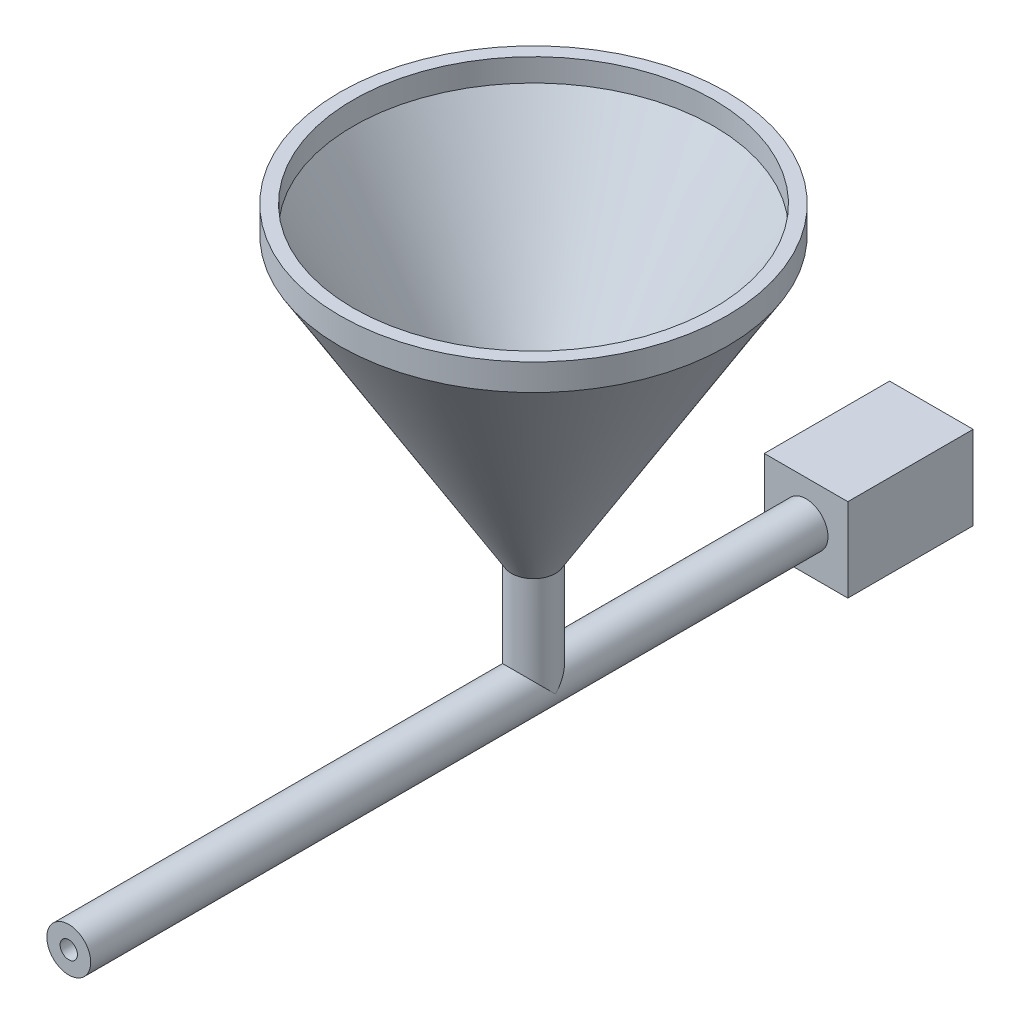
ISO-10303-21;
HEADER;
FILE_DESCRIPTION(('STEP AP214'),'2;1');
FILE_NAME('part.step','',(''),(''),'','','');
FILE_SCHEMA(('AUTOMOTIVE_DESIGN { 1 0 10303 214 1 1 1 1 }'));
ENDSEC;
DATA;
#1=APPLICATION_CONTEXT('core data for automotive mechanical design processes');
#2=APPLICATION_PROTOCOL_DEFINITION('international standard','automotive_design',2000,#1);
#3=PRODUCT_CONTEXT('',#1,'mechanical');
#4=PRODUCT('Part','Part','',(#3));
#5=PRODUCT_RELATED_PRODUCT_CATEGORY('part','',(#4));
#6=PRODUCT_DEFINITION_FORMATION('','',#4);
#7=PRODUCT_DEFINITION_CONTEXT('part definition',#1,'design');
#8=PRODUCT_DEFINITION('design','',#6,#7);
#9=PRODUCT_DEFINITION_SHAPE('','',#8);
#10=(LENGTH_UNIT() NAMED_UNIT(*) SI_UNIT(.MILLI.,.METRE.));
#11=(NAMED_UNIT(*) PLANE_ANGLE_UNIT() SI_UNIT($,.RADIAN.));
#12=(NAMED_UNIT(*) SI_UNIT($,.STERADIAN.) SOLID_ANGLE_UNIT());
#13=UNCERTAINTY_MEASURE_WITH_UNIT(LENGTH_MEASURE(1.E-05),#10,'distance_accuracy_value','');
#14=(GEOMETRIC_REPRESENTATION_CONTEXT(3) GLOBAL_UNCERTAINTY_ASSIGNED_CONTEXT((#13)) GLOBAL_UNIT_ASSIGNED_CONTEXT((#10,
#11,#12)) REPRESENTATION_CONTEXT('',''));
#15=CARTESIAN_POINT('',(0.,0.,0.));
#16=DIRECTION('',(0.,0.,1.));
#17=DIRECTION('',(1.,0.,0.));
#18=AXIS2_PLACEMENT_3D('',#15,#16,#17);
#19=CARTESIAN_POINT('',(-20.,-178.710342853305,-190.5));
#20=DIRECTION('',(1.,0.,0.));
#21=DIRECTION('',(0.,1.,0.));
#22=AXIS2_PLACEMENT_3D('',#19,#20,#21);
#23=PLANE('',#22);
#24=DIRECTION('',(0.,1.,0.));
#25=VECTOR('',#24,1.);
#26=CARTESIAN_POINT('',(-20.,-178.710342853305,-130.5));
#27=LINE('',#26,#25);
#28=CARTESIAN_POINT('',(-20.,-218.710342853305,-130.5));
#29=VERTEX_POINT('',#28);
#30=CARTESIAN_POINT('',(-20.,-178.710342853305,-130.5));
#31=VERTEX_POINT('',#30);
#32=EDGE_CURVE('E115',#29,#31,#27,.T.);
#33=ORIENTED_EDGE('',*,*,#32,.T.);
#34=DIRECTION('',(0.,0.,1.));
#35=VECTOR('',#34,1.);
#36=CARTESIAN_POINT('',(-20.,-178.710342853305,-190.5));
#37=LINE('',#36,#35);
#38=CARTESIAN_POINT('',(-20.,-178.710342853305,-190.5));
#39=VERTEX_POINT('',#38);
#40=EDGE_CURVE('E13',#39,#31,#37,.T.);
#41=ORIENTED_EDGE('',*,*,#40,.F.);
#42=DIRECTION('',(0.,1.,0.));
#43=VECTOR('',#42,1.);
#44=CARTESIAN_POINT('',(-20.,-178.710342853305,-190.5));
#45=LINE('',#44,#43);
#46=CARTESIAN_POINT('',(-20.,-218.710342853305,-190.5));
#47=VERTEX_POINT('',#46);
#48=EDGE_CURVE('E103',#47,#39,#45,.T.);
#49=ORIENTED_EDGE('',*,*,#48,.F.);
#50=DIRECTION('',(0.,0.,1.));
#51=VECTOR('',#50,1.);
#52=CARTESIAN_POINT('',(-20.,-218.710342853305,-190.5));
#53=LINE('',#52,#51);
#54=EDGE_CURVE('E111',#47,#29,#53,.T.);
#55=ORIENTED_EDGE('',*,*,#54,.T.);
#56=EDGE_LOOP('',(#33,#41,#49,#55));
#57=FACE_BOUND('',#56,.T.);
#58=ADVANCED_FACE('F52',(#57),#23,.F.);
#59=CARTESIAN_POINT('',(20.,-178.710342853305,-190.5));
#60=DIRECTION('',(0.,-1.,0.));
#61=DIRECTION('',(0.,0.,-1.));
#62=AXIS2_PLACEMENT_3D('',#59,#60,#61);
#63=PLANE('',#62);
#64=DIRECTION('',(1.,0.,0.));
#65=VECTOR('',#64,1.);
#66=CARTESIAN_POINT('',(20.,-178.710342853305,-130.5));
#67=LINE('',#66,#65);
#68=CARTESIAN_POINT('',(20.,-178.710342853305,-130.5));
#69=VERTEX_POINT('',#68);
#70=EDGE_CURVE('E107',#31,#69,#67,.T.);
#71=ORIENTED_EDGE('',*,*,#70,.T.);
#72=DIRECTION('',(0.,0.,1.));
#73=VECTOR('',#72,1.);
#74=CARTESIAN_POINT('',(20.,-178.710342853305,-190.5));
#75=LINE('',#74,#73);
#76=CARTESIAN_POINT('',(20.,-178.710342853305,-190.5));
#77=VERTEX_POINT('',#76);
#78=EDGE_CURVE('E60',#77,#69,#75,.T.);
#79=ORIENTED_EDGE('',*,*,#78,.F.);
#80=DIRECTION('',(1.,0.,0.));
#81=VECTOR('',#80,1.);
#82=CARTESIAN_POINT('',(20.,-178.710342853305,-190.5));
#83=LINE('',#82,#81);
#84=EDGE_CURVE('E98',#39,#77,#83,.T.);
#85=ORIENTED_EDGE('',*,*,#84,.F.);
#86=ORIENTED_EDGE('',*,*,#40,.T.);
#87=EDGE_LOOP('',(#71,#79,#85,#86));
#88=FACE_BOUND('',#87,.T.);
#89=ADVANCED_FACE('F106',(#88),#63,.F.);
#90=CARTESIAN_POINT('',(20.,-178.710342853305,-190.5));
#91=DIRECTION('',(-1.,0.,0.));
#92=DIRECTION('',(0.,-1.,0.));
#93=AXIS2_PLACEMENT_3D('',#90,#91,#92);
#94=PLANE('',#93);
#95=DIRECTION('',(0.,-1.,0.));
#96=VECTOR('',#95,1.);
#97=CARTESIAN_POINT('',(20.,-178.710342853305,-130.5));
#98=LINE('',#97,#96);
#99=CARTESIAN_POINT('',(20.,-218.710342853305,-130.5));
#100=VERTEX_POINT('',#99);
#101=EDGE_CURVE('E85',#69,#100,#98,.T.);
#102=ORIENTED_EDGE('',*,*,#101,.T.);
#103=DIRECTION('',(0.,0.,1.));
#104=VECTOR('',#103,1.);
#105=CARTESIAN_POINT('',(20.,-218.710342853305,-190.5));
#106=LINE('',#105,#104);
#107=CARTESIAN_POINT('',(20.,-218.710342853305,-190.5));
#108=VERTEX_POINT('',#107);
#109=EDGE_CURVE('E108',#108,#100,#106,.T.);
#110=ORIENTED_EDGE('',*,*,#109,.F.);
#111=DIRECTION('',(0.,-1.,0.));
#112=VECTOR('',#111,1.);
#113=CARTESIAN_POINT('',(20.,-178.710342853305,-190.5));
#114=LINE('',#113,#112);
#115=EDGE_CURVE('E101',#77,#108,#114,.T.);
#116=ORIENTED_EDGE('',*,*,#115,.F.);
#117=ORIENTED_EDGE('',*,*,#78,.T.);
#118=EDGE_LOOP('',(#102,#110,#116,#117));
#119=FACE_BOUND('',#118,.T.);
#120=ADVANCED_FACE('F109',(#119),#94,.F.);
#121=CARTESIAN_POINT('',(20.,-218.710342853305,-190.5));
#122=DIRECTION('',(0.,1.,0.));
#123=DIRECTION('',(0.,0.,1.));
#124=AXIS2_PLACEMENT_3D('',#121,#122,#123);
#125=PLANE('',#124);
#126=DIRECTION('',(-1.,0.,0.));
#127=VECTOR('',#126,1.);
#128=CARTESIAN_POINT('',(20.,-218.710342853305,-130.5));
#129=LINE('',#128,#127);
#130=EDGE_CURVE('E91',#100,#29,#129,.T.);
#131=ORIENTED_EDGE('',*,*,#130,.T.);
#132=ORIENTED_EDGE('',*,*,#54,.F.);
#133=DIRECTION('',(-1.,0.,0.));
#134=VECTOR('',#133,1.);
#135=CARTESIAN_POINT('',(20.,-218.710342853305,-190.5));
#136=LINE('',#135,#134);
#137=EDGE_CURVE('E68',#108,#47,#136,.T.);
#138=ORIENTED_EDGE('',*,*,#137,.F.);
#139=ORIENTED_EDGE('',*,*,#109,.T.);
#140=EDGE_LOOP('',(#131,#132,#138,#139));
#141=FACE_BOUND('',#140,.T.);
#142=ADVANCED_FACE('F122',(#141),#125,.F.);
#143=CARTESIAN_POINT('',(0.,0.,-190.5));
#144=DIRECTION('',(0.,0.,-1.));
#145=DIRECTION('',(-1.,0.,0.));
#146=AXIS2_PLACEMENT_3D('',#143,#144,#145);
#147=PLANE('',#146);
#148=ORIENTED_EDGE('',*,*,#48,.T.);
#149=ORIENTED_EDGE('',*,*,#84,.T.);
#150=ORIENTED_EDGE('',*,*,#115,.T.);
#151=ORIENTED_EDGE('',*,*,#137,.T.);
#152=EDGE_LOOP('',(#148,#149,#150,#151));
#153=FACE_BOUND('',#152,.T.);
#154=ADVANCED_FACE('F99',(#153),#147,.T.);
#155=CARTESIAN_POINT('',(0.,0.,-130.5));
#156=DIRECTION('',(0.,0.,-1.));
#157=DIRECTION('',(-1.,0.,0.));
#158=AXIS2_PLACEMENT_3D('',#155,#156,#157);
#159=PLANE('',#158);
#160=ORIENTED_EDGE('',*,*,#32,.F.);
#161=ORIENTED_EDGE('',*,*,#130,.F.);
#162=ORIENTED_EDGE('',*,*,#101,.F.);
#163=ORIENTED_EDGE('',*,*,#70,.F.);
#164=EDGE_LOOP('',(#160,#161,#162,#163));
#165=FACE_BOUND('',#164,.T.);
#166=ADVANCED_FACE('F125',(#165),#159,.F.);
#167=CLOSED_SHELL('',(#58,#89,#120,#142,#154,#166));
#168=MANIFOLD_SOLID_BREP('B2',#167);
#169=CARTESIAN_POINT('',(0.,-198.,0.));
#170=DIRECTION('',(0.,1.,0.));
#171=DIRECTION('',(0.,0.,1.));
#172=AXIS2_PLACEMENT_3D('',#169,#170,#171);
#173=CYLINDRICAL_SURFACE('',#172,10.5);
#174=CARTESIAN_POINT('',(0.,-148.,0.));
#175=DIRECTION('',(0.,-1.,0.));
#176=DIRECTION('',(0.,0.,-1.));
#177=AXIS2_PLACEMENT_3D('',#174,#175,#176);
#178=CIRCLE('',#177,10.5);
#179=CARTESIAN_POINT('',(0.,-148.,-10.5));
#180=VERTEX_POINT('',#179);
#181=EDGE_CURVE('E241',#180,#180,#178,.T.);
#182=ORIENTED_EDGE('',*,*,#181,.T.);
#183=EDGE_LOOP('',(#182));
#184=FACE_BOUND('',#183,.T.);
#185=CARTESIAN_POINT('',(0.,-198.,0.));
#186=DIRECTION('',(0.,0.707106781186547,0.707106781186547));
#187=DIRECTION('',(0.,0.707106781186547,-0.707106781186547));
#188=AXIS2_PLACEMENT_3D('',#185,#186,#187);
#189=ELLIPSE('',#188,14.8492424049175,10.5);
#190=CARTESIAN_POINT('',(-10.5,-198.,0.));
#191=VERTEX_POINT('',#190);
#192=CARTESIAN_POINT('',(10.5,-198.,0.));
#193=VERTEX_POINT('',#192);
#194=EDGE_CURVE('E202',#191,#193,#189,.F.);
#195=ORIENTED_EDGE('',*,*,#194,.F.);
#196=CARTESIAN_POINT('',(0.,-198.,0.));
#197=DIRECTION('',(0.,0.707106781186547,-0.707106781186547));
#198=DIRECTION('',(0.,0.707106781186547,0.707106781186547));
#199=AXIS2_PLACEMENT_3D('',#196,#197,#198);
#200=ELLIPSE('',#199,14.8492424049175,10.5);
#201=EDGE_CURVE('E199',#193,#191,#200,.F.);
#202=ORIENTED_EDGE('',*,*,#201,.F.);
#203=EDGE_LOOP('',(#195,#202));
#204=FACE_BOUND('',#203,.T.);
#205=ADVANCED_FACE('F181',(#184,#204),#173,.T.);
#206=CARTESIAN_POINT('',(0.,-12.7,0.));
#207=DIRECTION('',(0.,1.,0.));
#208=DIRECTION('',(0.,0.,1.));
#209=AXIS2_PLACEMENT_3D('',#206,#207,#208);
#210=CYLINDRICAL_SURFACE('',#209,92.69375);
#211=CARTESIAN_POINT('',(0.,-12.7,0.));
#212=DIRECTION('',(0.,-1.,0.));
#213=DIRECTION('',(0.,0.,-1.));
#214=AXIS2_PLACEMENT_3D('',#211,#212,#213);
#215=CIRCLE('',#214,92.69375);
#216=CARTESIAN_POINT('',(0.,-12.7,-92.69375));
#217=VERTEX_POINT('',#216);
#218=EDGE_CURVE('E192',#217,#217,#215,.T.);
#219=ORIENTED_EDGE('',*,*,#218,.F.);
#220=EDGE_LOOP('',(#219));
#221=FACE_BOUND('',#220,.T.);
#222=CARTESIAN_POINT('',(0.,0.,0.));
#223=DIRECTION('',(0.,1.,0.));
#224=DIRECTION('',(0.,0.,1.));
#225=AXIS2_PLACEMENT_3D('',#222,#223,#224);
#226=CIRCLE('',#225,92.69375);
#227=CARTESIAN_POINT('',(0.,0.,92.69375));
#228=VERTEX_POINT('',#227);
#229=EDGE_CURVE('E50',#228,#228,#226,.T.);
#230=ORIENTED_EDGE('',*,*,#229,.F.);
#231=EDGE_LOOP('',(#230));
#232=FACE_BOUND('',#231,.T.);
#233=ADVANCED_FACE('F183',(#221,#232),#210,.T.);
#234=CARTESIAN_POINT('',(0.,0.,0.));
#235=DIRECTION('',(0.,1.,0.));
#236=DIRECTION('',(0.,0.,1.));
#237=AXIS2_PLACEMENT_3D('',#234,#235,#236);
#238=PLANE('',#237);
#239=CARTESIAN_POINT('',(0.,0.,0.));
#240=DIRECTION('',(0.,1.,0.));
#241=DIRECTION('',(0.,0.,1.));
#242=AXIS2_PLACEMENT_3D('',#239,#240,#241);
#243=CIRCLE('',#242,86.34375);
#244=CARTESIAN_POINT('',(0.,0.,86.34375));
#245=VERTEX_POINT('',#244);
#246=EDGE_CURVE('E227',#245,#245,#243,.T.);
#247=ORIENTED_EDGE('',*,*,#246,.F.);
#248=EDGE_LOOP('',(#247));
#249=FACE_BOUND('',#248,.T.);
#250=ORIENTED_EDGE('',*,*,#229,.T.);
#251=EDGE_LOOP('',(#250));
#252=FACE_BOUND('',#251,.T.);
#253=ADVANCED_FACE('F259',(#249,#252),#238,.T.);
#254=CARTESIAN_POINT('',(0.,-148.,0.));
#255=DIRECTION('',(0.,1.,0.));
#256=DIRECTION('',(0.,0.,1.));
#257=AXIS2_PLACEMENT_3D('',#254,#255,#256);
#258=CONICAL_SURFACE('',#257,10.5,0.545910565175141);
#259=ORIENTED_EDGE('',*,*,#181,.F.);
#260=EDGE_LOOP('',(#259));
#261=FACE_BOUND('',#260,.T.);
#262=ORIENTED_EDGE('',*,*,#218,.T.);
#263=EDGE_LOOP('',(#262));
#264=FACE_BOUND('',#263,.T.);
#265=ADVANCED_FACE('F250',(#261,#264),#258,.T.);
#266=CARTESIAN_POINT('',(0.,-198.,-130.5));
#267=DIRECTION('',(0.,0.,1.));
#268=DIRECTION('',(1.,0.,0.));
#269=AXIS2_PLACEMENT_3D('',#266,#267,#268);
#270=CYLINDRICAL_SURFACE('',#269,10.5);
#271=CARTESIAN_POINT('',(0.,-198.,-130.5));
#272=DIRECTION('',(0.,0.,-1.));
#273=DIRECTION('',(-1.,0.,0.));
#274=AXIS2_PLACEMENT_3D('',#271,#272,#273);
#275=CIRCLE('',#274,10.5);
#276=CARTESIAN_POINT('',(-10.5,-198.,-130.5));
#277=VERTEX_POINT('',#276);
#278=EDGE_CURVE('E236',#277,#277,#275,.T.);
#279=ORIENTED_EDGE('',*,*,#278,.F.);
#280=EDGE_LOOP('',(#279));
#281=FACE_BOUND('',#280,.T.);
#282=CARTESIAN_POINT('',(0.,-198.,222.5));
#283=DIRECTION('',(0.,0.,-1.));
#284=DIRECTION('',(-1.,0.,0.));
#285=AXIS2_PLACEMENT_3D('',#282,#283,#284);
#286=CIRCLE('',#285,10.5);
#287=CARTESIAN_POINT('',(-10.5,-198.,222.5));
#288=VERTEX_POINT('',#287);
#289=EDGE_CURVE('E231',#288,#288,#286,.T.);
#290=ORIENTED_EDGE('',*,*,#289,.T.);
#291=EDGE_LOOP('',(#290));
#292=FACE_BOUND('',#291,.T.);
#293=ORIENTED_EDGE('',*,*,#201,.T.);
#294=ORIENTED_EDGE('',*,*,#194,.T.);
#295=EDGE_LOOP('',(#293,#294));
#296=FACE_BOUND('',#295,.T.);
#297=ADVANCED_FACE('F258',(#281,#292,#296),#270,.T.);
#298=CARTESIAN_POINT('',(0.,-198.,-130.5));
#299=DIRECTION('',(0.,0.,-1.));
#300=DIRECTION('',(-1.,0.,0.));
#301=AXIS2_PLACEMENT_3D('',#298,#299,#300);
#302=PLANE('',#301);
#303=ORIENTED_EDGE('',*,*,#278,.T.);
#304=EDGE_LOOP('',(#303));
#305=FACE_BOUND('',#304,.T.);
#306=ADVANCED_FACE('F298',(#305),#302,.T.);
#307=CARTESIAN_POINT('',(0.,-198.,222.5));
#308=DIRECTION('',(0.,0.,-1.));
#309=DIRECTION('',(-1.,0.,0.));
#310=AXIS2_PLACEMENT_3D('',#307,#308,#309);
#311=PLANE('',#310);
#312=CARTESIAN_POINT('',(0.,-198.,222.5));
#313=DIRECTION('',(0.,0.,-1.));
#314=DIRECTION('',(-1.,0.,0.));
#315=AXIS2_PLACEMENT_3D('',#312,#313,#314);
#316=CIRCLE('',#315,4.15000000000001);
#317=CARTESIAN_POINT('',(-4.15000000000001,-198.,222.5));
#318=VERTEX_POINT('',#317);
#319=EDGE_CURVE('E221',#318,#318,#316,.T.);
#320=ORIENTED_EDGE('',*,*,#319,.T.);
#321=EDGE_LOOP('',(#320));
#322=FACE_BOUND('',#321,.T.);
#323=ORIENTED_EDGE('',*,*,#289,.F.);
#324=EDGE_LOOP('',(#323));
#325=FACE_BOUND('',#324,.T.);
#326=ADVANCED_FACE('F305',(#322,#325),#311,.F.);
#327=CARTESIAN_POINT('',(0.,-198.,0.));
#328=DIRECTION('',(0.,1.,0.));
#329=DIRECTION('',(0.,0.,1.));
#330=AXIS2_PLACEMENT_3D('',#327,#328,#329);
#331=CYLINDRICAL_SURFACE('',#330,4.15);
#332=CARTESIAN_POINT('',(0.,-146.22236580956,0.));
#333=DIRECTION('',(0.,1.,0.));
#334=DIRECTION('',(0.,0.,1.));
#335=AXIS2_PLACEMENT_3D('',#332,#333,#334);
#336=CIRCLE('',#335,4.15);
#337=CARTESIAN_POINT('',(0.,-146.22236580956,4.15));
#338=VERTEX_POINT('',#337);
#339=EDGE_CURVE('E215',#338,#338,#336,.F.);
#340=ORIENTED_EDGE('',*,*,#339,.F.);
#341=EDGE_LOOP('',(#340));
#342=FACE_BOUND('',#341,.T.);
#343=CARTESIAN_POINT('',(0.,-198.,0.));
#344=DIRECTION('',(0.,0.707106781186547,0.707106781186547));
#345=DIRECTION('',(0.,0.707106781186547,-0.707106781186547));
#346=AXIS2_PLACEMENT_3D('',#343,#344,#345);
#347=ELLIPSE('',#346,5.86898628384835,4.15);
#348=CARTESIAN_POINT('',(-4.15000000000001,-198.,0.));
#349=VERTEX_POINT('',#348);
#350=CARTESIAN_POINT('',(4.15,-198.,0.));
#351=VERTEX_POINT('',#350);
#352=EDGE_CURVE('E210',#349,#351,#347,.F.);
#353=ORIENTED_EDGE('',*,*,#352,.T.);
#354=CARTESIAN_POINT('',(0.,-198.,0.));
#355=DIRECTION('',(0.,0.707106781186547,-0.707106781186547));
#356=DIRECTION('',(0.,0.707106781186547,0.707106781186547));
#357=AXIS2_PLACEMENT_3D('',#354,#355,#356);
#358=ELLIPSE('',#357,5.86898628384835,4.15);
#359=EDGE_CURVE('E213',#351,#349,#358,.F.);
#360=ORIENTED_EDGE('',*,*,#359,.T.);
#361=EDGE_LOOP('',(#353,#360));
#362=FACE_BOUND('',#361,.T.);
#363=ADVANCED_FACE('F217',(#342,#362),#331,.F.);
#364=CARTESIAN_POINT('',(0.,-12.7,0.));
#365=DIRECTION('',(0.,1.,0.));
#366=DIRECTION('',(0.,0.,1.));
#367=AXIS2_PLACEMENT_3D('',#364,#365,#366);
#368=CYLINDRICAL_SURFACE('',#367,86.34375);
#369=CARTESIAN_POINT('',(0.,-10.9223658095595,0.));
#370=DIRECTION('',(0.,1.,0.));
#371=DIRECTION('',(0.,0.,1.));
#372=AXIS2_PLACEMENT_3D('',#369,#370,#371);
#373=CIRCLE('',#372,86.34375);
#374=CARTESIAN_POINT('',(0.,-10.9223658095595,86.34375));
#375=VERTEX_POINT('',#374);
#376=EDGE_CURVE('E225',#375,#375,#373,.F.);
#377=ORIENTED_EDGE('',*,*,#376,.T.);
#378=EDGE_LOOP('',(#377));
#379=FACE_BOUND('',#378,.T.);
#380=ORIENTED_EDGE('',*,*,#246,.T.);
#381=EDGE_LOOP('',(#380));
#382=FACE_BOUND('',#381,.T.);
#383=ADVANCED_FACE('F320',(#379,#382),#368,.F.);
#384=CARTESIAN_POINT('',(0.,-144.703102068723,0.));
#385=DIRECTION('',(0.,1.,0.));
#386=DIRECTION('',(0.,0.,1.));
#387=AXIS2_PLACEMENT_3D('',#384,#385,#386);
#388=CONICAL_SURFACE('',#387,5.07294149370553,0.545910565175141);
#389=CARTESIAN_POINT('',(0.,-146.22236580956,4.15));
#390=CARTESIAN_POINT('',(0.,-144.81299080956,5.00618489583333));
#391=CARTESIAN_POINT('',(0.,-143.40361580956,5.86236979166666));
#392=CARTESIAN_POINT('',(0.,-140.58486580956,7.57473958333333));
#393=CARTESIAN_POINT('',(0.,-139.17549080956,8.43092447916666));
#394=CARTESIAN_POINT('',(0.,-136.35674080956,10.1432942708333));
#395=CARTESIAN_POINT('',(0.,-134.94736580956,10.9994791666667));
#396=CARTESIAN_POINT('',(0.,-132.12861580956,12.7118489583333));
#397=CARTESIAN_POINT('',(0.,-130.71924080956,13.5680338541667));
#398=CARTESIAN_POINT('',(0.,-127.90049080956,15.2804036458333));
#399=CARTESIAN_POINT('',(0.,-126.49111580956,16.1365885416667));
#400=CARTESIAN_POINT('',(0.,-123.67236580956,17.8489583333333));
#401=CARTESIAN_POINT('',(0.,-122.26299080956,18.7051432291667));
#402=CARTESIAN_POINT('',(0.,-119.44424080956,20.4175130208333));
#403=CARTESIAN_POINT('',(0.,-118.03486580956,21.2736979166667));
#404=CARTESIAN_POINT('',(0.,-115.21611580956,22.9860677083333));
#405=CARTESIAN_POINT('',(0.,-113.80674080956,23.8422526041667));
#406=CARTESIAN_POINT('',(0.,-110.98799080956,25.5546223958333));
#407=CARTESIAN_POINT('',(0.,-109.57861580956,26.4108072916667));
#408=CARTESIAN_POINT('',(0.,-106.75986580956,28.1231770833333));
#409=CARTESIAN_POINT('',(0.,-105.35049080956,28.9793619791667));
#410=CARTESIAN_POINT('',(0.,-102.53174080956,30.6917317708333));
#411=CARTESIAN_POINT('',(0.,-101.12236580956,31.5479166666667));
#412=CARTESIAN_POINT('',(0.,-98.3036158095595,33.2602864583333));
#413=CARTESIAN_POINT('',(0.,-96.8942408095595,34.1164713541667));
#414=CARTESIAN_POINT('',(0.,-94.0754908095595,35.8288411458333));
#415=CARTESIAN_POINT('',(0.,-92.6661158095595,36.6850260416667));
#416=CARTESIAN_POINT('',(0.,-89.8473658095595,38.3973958333333));
#417=CARTESIAN_POINT('',(0.,-88.4379908095595,39.2535807291667));
#418=CARTESIAN_POINT('',(0.,-85.6192408095595,40.9659505208333));
#419=CARTESIAN_POINT('',(0.,-84.2098658095595,41.8221354166667));
#420=CARTESIAN_POINT('',(0.,-81.3911158095595,43.5345052083333));
#421=CARTESIAN_POINT('',(0.,-79.9817408095595,44.3906901041667));
#422=CARTESIAN_POINT('',(0.,-77.1629908095595,46.1030598958333));
#423=CARTESIAN_POINT('',(0.,-75.7536158095595,46.9592447916667));
#424=CARTESIAN_POINT('',(0.,-72.9348658095595,48.6716145833333));
#425=CARTESIAN_POINT('',(0.,-71.5254908095595,49.5277994791667));
#426=CARTESIAN_POINT('',(0.,-68.7067408095595,51.2401692708333));
#427=CARTESIAN_POINT('',(0.,-67.2973658095595,52.0963541666667));
#428=CARTESIAN_POINT('',(0.,-64.4786158095595,53.8087239583333));
#429=CARTESIAN_POINT('',(0.,-63.0692408095595,54.6649088541667));
#430=CARTESIAN_POINT('',(0.,-60.2504908095595,56.3772786458333));
#431=CARTESIAN_POINT('',(0.,-58.8411158095595,57.2334635416667));
#432=CARTESIAN_POINT('',(0.,-56.0223658095595,58.9458333333333));
#433=CARTESIAN_POINT('',(0.,-54.6129908095595,59.8020182291667));
#434=CARTESIAN_POINT('',(0.,-51.7942408095595,61.5143880208333));
#435=CARTESIAN_POINT('',(0.,-50.3848658095595,62.3705729166667));
#436=CARTESIAN_POINT('',(0.,-47.5661158095595,64.0829427083333));
#437=CARTESIAN_POINT('',(0.,-46.1567408095595,64.9391276041667));
#438=CARTESIAN_POINT('',(0.,-43.3379908095595,66.6514973958333));
#439=CARTESIAN_POINT('',(0.,-41.9286158095595,67.5076822916667));
#440=CARTESIAN_POINT('',(0.,-39.1098658095595,69.2200520833333));
#441=CARTESIAN_POINT('',(0.,-37.7004908095595,70.0762369791667));
#442=CARTESIAN_POINT('',(0.,-34.8817408095595,71.7886067708333));
#443=CARTESIAN_POINT('',(0.,-33.4723658095595,72.6447916666666));
#444=CARTESIAN_POINT('',(0.,-30.6536158095595,74.3571614583333));
#445=CARTESIAN_POINT('',(0.,-29.2442408095595,75.2133463541667));
#446=CARTESIAN_POINT('',(0.,-26.4254908095595,76.9257161458333));
#447=CARTESIAN_POINT('',(0.,-25.0161158095595,77.7819010416667));
#448=CARTESIAN_POINT('',(0.,-22.1973658095595,79.4942708333333));
#449=CARTESIAN_POINT('',(0.,-20.7879908095595,80.3504557291667));
#450=CARTESIAN_POINT('',(0.,-17.9692408095595,82.0628255208333));
#451=CARTESIAN_POINT('',(0.,-16.5598658095595,82.9190104166667));
#452=CARTESIAN_POINT('',(0.,-13.7411158095595,84.6313802083333));
#453=CARTESIAN_POINT('',(0.,-12.3317408095595,85.4875651041667));
#454=CARTESIAN_POINT('',(0.,-10.9223658095595,86.34375));
#455=B_SPLINE_CURVE_WITH_KNOTS('',3,(#389,#390,#391,#392,#393,#394,#395,#396,#397,#398,#399,
#400,#401,#402,#403,#404,#405,#406,#407,#408,#409,#410,#411,#412,#413,#414,#415,#416,#417,#418,
#419,#420,#421,#422,#423,#424,#425,#426,#427,#428,#429,#430,#431,#432,#433,#434,#435,#436,#437,
#438,#439,#440,#441,#442,#443,#444,#445,#446,#447,#448,#449,#450,#451,#452,#453,#454),
.UNSPECIFIED.,.F.,.F.,(4,2,2,2,2,2,2,2,2,2,2,2,2,2,2,2,2,2,2,2,2,2,2,2,2,2,2,2,2,2,2,2,4),(0.,
4.94717234370336,9.89434468740671,14.8415170311101,19.7886893748134,24.7358617185167,
29.6830340622201,34.6302064059234,39.5773787496268,44.5245510933301,49.4717234370335,
54.4188957807368,59.3660681244401,64.3132404681435,69.2604128118468,74.2075851555502,
79.1547574992535,84.1019298429569,89.0491021866602,93.9962745303636,98.9434468740669,
103.89061921777,108.837791561474,113.784963905177,118.73213624888,123.679308592584,
128.626480936287,133.57365327999,138.520825623694,143.467997967397,148.4151703111,
153.362342654804,158.309514998507),.UNSPECIFIED.);
#456=EDGE_CURVE('BSEAM328',#338,#375,#455,.T.);
#457=ORIENTED_EDGE('',*,*,#339,.T.);
#458=ORIENTED_EDGE('',*,*,#376,.F.);
#459=ORIENTED_EDGE('',*,*,#456,.T.);
#460=ORIENTED_EDGE('',*,*,#456,.F.);
#461=EDGE_LOOP('',(#457,#459,#458,#460));
#462=FACE_BOUND('',#461,.T.);
#463=ADVANCED_FACE('F328',(#462),#388,.F.);
#464=CARTESIAN_POINT('',(0.,-198.,-130.5));
#465=DIRECTION('',(0.,0.,1.));
#466=DIRECTION('',(1.,0.,0.));
#467=AXIS2_PLACEMENT_3D('',#464,#465,#466);
#468=CYLINDRICAL_SURFACE('',#467,4.15000000000001);
#469=CARTESIAN_POINT('',(0.,-198.,-124.15));
#470=DIRECTION('',(0.,0.,-1.));
#471=DIRECTION('',(-1.,0.,0.));
#472=AXIS2_PLACEMENT_3D('',#469,#470,#471);
#473=CIRCLE('',#472,4.15000000000001);
#474=CARTESIAN_POINT('',(-4.15000000000001,-198.,-124.15));
#475=VERTEX_POINT('',#474);
#476=EDGE_CURVE('E218',#475,#475,#473,.T.);
#477=ORIENTED_EDGE('',*,*,#476,.T.);
#478=EDGE_LOOP('',(#477));
#479=FACE_BOUND('',#478,.T.);
#480=ORIENTED_EDGE('',*,*,#319,.F.);
#481=EDGE_LOOP('',(#480));
#482=FACE_BOUND('',#481,.T.);
#483=ORIENTED_EDGE('',*,*,#359,.F.);
#484=ORIENTED_EDGE('',*,*,#352,.F.);
#485=EDGE_LOOP('',(#483,#484));
#486=FACE_BOUND('',#485,.T.);
#487=ADVANCED_FACE('F212',(#479,#482,#486),#468,.F.);
#488=CARTESIAN_POINT('',(0.,-198.,-124.15));
#489=DIRECTION('',(0.,0.,-1.));
#490=DIRECTION('',(-1.,0.,0.));
#491=AXIS2_PLACEMENT_3D('',#488,#489,#490);
#492=PLANE('',#491);
#493=ORIENTED_EDGE('',*,*,#476,.F.);
#494=EDGE_LOOP('',(#493));
#495=FACE_BOUND('',#494,.T.);
#496=ADVANCED_FACE('F343',(#495),#492,.F.);
#497=CLOSED_SHELL('',(#205,#233,#253,#265,#297,#306,#326,#363,#383,#463,#487,#496));
#498=MANIFOLD_SOLID_BREP('B7',#497);
#499=ADVANCED_BREP_SHAPE_REPRESENTATION('',(#18,#168,#498),#14);
#500=SHAPE_DEFINITION_REPRESENTATION(#9,#499);
ENDSEC;
END-ISO-10303-21;
